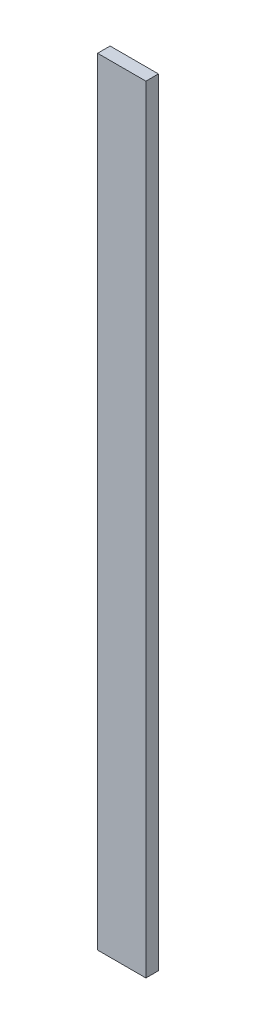
ISO-10303-21;
HEADER;
FILE_DESCRIPTION(('STEP AP214'),'2;1');
FILE_NAME('part.step','',(''),(''),'','','');
FILE_SCHEMA(('AUTOMOTIVE_DESIGN { 1 0 10303 214 1 1 1 1 }'));
ENDSEC;
DATA;
#1=APPLICATION_CONTEXT('core data for automotive mechanical design processes');
#2=APPLICATION_PROTOCOL_DEFINITION('international standard','automotive_design',2000,#1);
#3=PRODUCT_CONTEXT('',#1,'mechanical');
#4=PRODUCT('Part','Part','',(#3));
#5=PRODUCT_RELATED_PRODUCT_CATEGORY('part','',(#4));
#6=PRODUCT_DEFINITION_FORMATION('','',#4);
#7=PRODUCT_DEFINITION_CONTEXT('part definition',#1,'design');
#8=PRODUCT_DEFINITION('design','',#6,#7);
#9=PRODUCT_DEFINITION_SHAPE('','',#8);
#10=(LENGTH_UNIT() NAMED_UNIT(*) SI_UNIT(.MILLI.,.METRE.));
#11=(NAMED_UNIT(*) PLANE_ANGLE_UNIT() SI_UNIT($,.RADIAN.));
#12=(NAMED_UNIT(*) SI_UNIT($,.STERADIAN.) SOLID_ANGLE_UNIT());
#13=UNCERTAINTY_MEASURE_WITH_UNIT(LENGTH_MEASURE(1.E-05),#10,'distance_accuracy_value','');
#14=(GEOMETRIC_REPRESENTATION_CONTEXT(3) GLOBAL_UNCERTAINTY_ASSIGNED_CONTEXT((#13)) GLOBAL_UNIT_ASSIGNED_CONTEXT((#10,
#11,#12)) REPRESENTATION_CONTEXT('',''));
#15=CARTESIAN_POINT('',(0.,0.,0.));
#16=DIRECTION('',(0.,0.,1.));
#17=DIRECTION('',(1.,0.,0.));
#18=AXIS2_PLACEMENT_3D('',#15,#16,#17);
#19=CARTESIAN_POINT('',(-24.5,787.4,-6.35));
#20=DIRECTION('',(1.,0.,0.));
#21=DIRECTION('',(0.,0.,-1.));
#22=AXIS2_PLACEMENT_3D('',#19,#20,#21);
#23=PLANE('',#22);
#24=DIRECTION('',(0.,0.,1.));
#25=VECTOR('',#24,1.);
#26=CARTESIAN_POINT('',(-24.5,0.,-6.35));
#27=LINE('',#26,#25);
#28=CARTESIAN_POINT('',(-24.5,0.,-6.35));
#29=VERTEX_POINT('',#28);
#30=CARTESIAN_POINT('',(-24.5,0.,6.35));
#31=VERTEX_POINT('',#30);
#32=EDGE_CURVE('E95',#29,#31,#27,.T.);
#33=ORIENTED_EDGE('',*,*,#32,.T.);
#34=DIRECTION('',(0.,-1.,0.));
#35=VECTOR('',#34,1.);
#36=CARTESIAN_POINT('',(-24.5,787.4,6.35));
#37=LINE('',#36,#35);
#38=CARTESIAN_POINT('',(-24.5,787.4,6.35));
#39=VERTEX_POINT('',#38);
#40=EDGE_CURVE('E11',#39,#31,#37,.T.);
#41=ORIENTED_EDGE('',*,*,#40,.F.);
#42=DIRECTION('',(0.,0.,1.));
#43=VECTOR('',#42,1.);
#44=CARTESIAN_POINT('',(-24.5,787.4,-6.35));
#45=LINE('',#44,#43);
#46=CARTESIAN_POINT('',(-24.5,787.4,-6.35));
#47=VERTEX_POINT('',#46);
#48=EDGE_CURVE('E83',#47,#39,#45,.T.);
#49=ORIENTED_EDGE('',*,*,#48,.F.);
#50=DIRECTION('',(0.,-1.,0.));
#51=VECTOR('',#50,1.);
#52=CARTESIAN_POINT('',(-24.5,787.4,-6.35));
#53=LINE('',#52,#51);
#54=EDGE_CURVE('E91',#47,#29,#53,.T.);
#55=ORIENTED_EDGE('',*,*,#54,.T.);
#56=EDGE_LOOP('',(#33,#41,#49,#55));
#57=FACE_BOUND('',#56,.T.);
#58=ADVANCED_FACE('F32',(#57),#23,.F.);
#59=CARTESIAN_POINT('',(24.5,787.4,6.35));
#60=DIRECTION('',(0.,0.,-1.));
#61=DIRECTION('',(-1.,0.,0.));
#62=AXIS2_PLACEMENT_3D('',#59,#60,#61);
#63=PLANE('',#62);
#64=DIRECTION('',(1.,0.,0.));
#65=VECTOR('',#64,1.);
#66=CARTESIAN_POINT('',(24.5,0.,6.35));
#67=LINE('',#66,#65);
#68=CARTESIAN_POINT('',(24.5,0.,6.35));
#69=VERTEX_POINT('',#68);
#70=EDGE_CURVE('E87',#31,#69,#67,.T.);
#71=ORIENTED_EDGE('',*,*,#70,.T.);
#72=DIRECTION('',(0.,-1.,0.));
#73=VECTOR('',#72,1.);
#74=CARTESIAN_POINT('',(24.5,787.4,6.35));
#75=LINE('',#74,#73);
#76=CARTESIAN_POINT('',(24.5,787.4,6.35));
#77=VERTEX_POINT('',#76);
#78=EDGE_CURVE('E40',#77,#69,#75,.T.);
#79=ORIENTED_EDGE('',*,*,#78,.F.);
#80=DIRECTION('',(1.,0.,0.));
#81=VECTOR('',#80,1.);
#82=CARTESIAN_POINT('',(24.5,787.4,6.35));
#83=LINE('',#82,#81);
#84=EDGE_CURVE('E78',#39,#77,#83,.T.);
#85=ORIENTED_EDGE('',*,*,#84,.F.);
#86=ORIENTED_EDGE('',*,*,#40,.T.);
#87=EDGE_LOOP('',(#71,#79,#85,#86));
#88=FACE_BOUND('',#87,.T.);
#89=ADVANCED_FACE('F86',(#88),#63,.F.);
#90=CARTESIAN_POINT('',(24.5,787.4,-6.35));
#91=DIRECTION('',(-1.,0.,0.));
#92=DIRECTION('',(0.,0.,1.));
#93=AXIS2_PLACEMENT_3D('',#90,#91,#92);
#94=PLANE('',#93);
#95=DIRECTION('',(0.,0.,-1.));
#96=VECTOR('',#95,1.);
#97=CARTESIAN_POINT('',(24.5,0.,-6.35));
#98=LINE('',#97,#96);
#99=CARTESIAN_POINT('',(24.5,0.,-6.35));
#100=VERTEX_POINT('',#99);
#101=EDGE_CURVE('E65',#69,#100,#98,.T.);
#102=ORIENTED_EDGE('',*,*,#101,.T.);
#103=DIRECTION('',(0.,-1.,0.));
#104=VECTOR('',#103,1.);
#105=CARTESIAN_POINT('',(24.5,787.4,-6.35));
#106=LINE('',#105,#104);
#107=CARTESIAN_POINT('',(24.5,787.4,-6.35));
#108=VERTEX_POINT('',#107);
#109=EDGE_CURVE('E88',#108,#100,#106,.T.);
#110=ORIENTED_EDGE('',*,*,#109,.F.);
#111=DIRECTION('',(0.,0.,-1.));
#112=VECTOR('',#111,1.);
#113=CARTESIAN_POINT('',(24.5,787.4,-6.35));
#114=LINE('',#113,#112);
#115=EDGE_CURVE('E81',#77,#108,#114,.T.);
#116=ORIENTED_EDGE('',*,*,#115,.F.);
#117=ORIENTED_EDGE('',*,*,#78,.T.);
#118=EDGE_LOOP('',(#102,#110,#116,#117));
#119=FACE_BOUND('',#118,.T.);
#120=ADVANCED_FACE('F89',(#119),#94,.F.);
#121=CARTESIAN_POINT('',(24.5,787.4,-6.35));
#122=DIRECTION('',(0.,0.,1.));
#123=DIRECTION('',(1.,0.,0.));
#124=AXIS2_PLACEMENT_3D('',#121,#122,#123);
#125=PLANE('',#124);
#126=DIRECTION('',(-1.,0.,0.));
#127=VECTOR('',#126,1.);
#128=CARTESIAN_POINT('',(24.5,0.,-6.35));
#129=LINE('',#128,#127);
#130=EDGE_CURVE('E71',#100,#29,#129,.T.);
#131=ORIENTED_EDGE('',*,*,#130,.T.);
#132=ORIENTED_EDGE('',*,*,#54,.F.);
#133=DIRECTION('',(-1.,0.,0.));
#134=VECTOR('',#133,1.);
#135=CARTESIAN_POINT('',(24.5,787.4,-6.35));
#136=LINE('',#135,#134);
#137=EDGE_CURVE('E48',#108,#47,#136,.T.);
#138=ORIENTED_EDGE('',*,*,#137,.F.);
#139=ORIENTED_EDGE('',*,*,#109,.T.);
#140=EDGE_LOOP('',(#131,#132,#138,#139));
#141=FACE_BOUND('',#140,.T.);
#142=ADVANCED_FACE('F102',(#141),#125,.F.);
#143=CARTESIAN_POINT('',(0.,787.4,0.));
#144=DIRECTION('',(0.,-1.,0.));
#145=DIRECTION('',(0.,0.,-1.));
#146=AXIS2_PLACEMENT_3D('',#143,#144,#145);
#147=PLANE('',#146);
#148=ORIENTED_EDGE('',*,*,#48,.T.);
#149=ORIENTED_EDGE('',*,*,#84,.T.);
#150=ORIENTED_EDGE('',*,*,#115,.T.);
#151=ORIENTED_EDGE('',*,*,#137,.T.);
#152=EDGE_LOOP('',(#148,#149,#150,#151));
#153=FACE_BOUND('',#152,.T.);
#154=ADVANCED_FACE('F79',(#153),#147,.F.);
#155=CARTESIAN_POINT('',(0.,0.,0.));
#156=DIRECTION('',(0.,-1.,0.));
#157=DIRECTION('',(0.,0.,-1.));
#158=AXIS2_PLACEMENT_3D('',#155,#156,#157);
#159=PLANE('',#158);
#160=ORIENTED_EDGE('',*,*,#32,.F.);
#161=ORIENTED_EDGE('',*,*,#130,.F.);
#162=ORIENTED_EDGE('',*,*,#101,.F.);
#163=ORIENTED_EDGE('',*,*,#70,.F.);
#164=EDGE_LOOP('',(#160,#161,#162,#163));
#165=FACE_BOUND('',#164,.T.);
#166=ADVANCED_FACE('F105',(#165),#159,.T.);
#167=CLOSED_SHELL('',(#58,#89,#120,#142,#154,#166));
#168=MANIFOLD_SOLID_BREP('B2',#167);
#169=ADVANCED_BREP_SHAPE_REPRESENTATION('',(#18,#168),#14);
#170=SHAPE_DEFINITION_REPRESENTATION(#9,#169);
ENDSEC;
END-ISO-10303-21;
